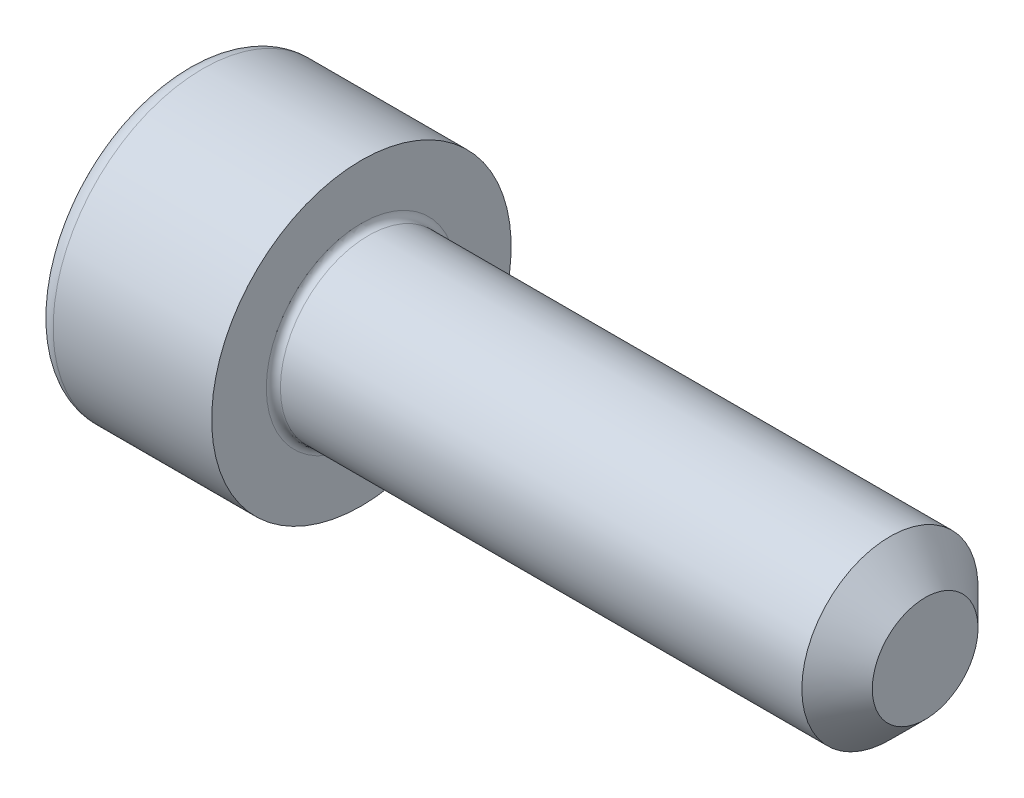
ISO-10303-21;
HEADER;
FILE_DESCRIPTION(('STEP AP214'),'2;1');
FILE_NAME('part.step','',(''),(''),'','','');
FILE_SCHEMA(('AUTOMOTIVE_DESIGN { 1 0 10303 214 1 1 1 1 }'));
ENDSEC;
DATA;
#1=APPLICATION_CONTEXT('core data for automotive mechanical design processes');
#2=APPLICATION_PROTOCOL_DEFINITION('international standard','automotive_design',2000,#1);
#3=PRODUCT_CONTEXT('',#1,'mechanical');
#4=PRODUCT('Part','Part','',(#3));
#5=PRODUCT_RELATED_PRODUCT_CATEGORY('part','',(#4));
#6=PRODUCT_DEFINITION_FORMATION('','',#4);
#7=PRODUCT_DEFINITION_CONTEXT('part definition',#1,'design');
#8=PRODUCT_DEFINITION('design','',#6,#7);
#9=PRODUCT_DEFINITION_SHAPE('','',#8);
#10=(LENGTH_UNIT() NAMED_UNIT(*) SI_UNIT(.MILLI.,.METRE.));
#11=(NAMED_UNIT(*) PLANE_ANGLE_UNIT() SI_UNIT($,.RADIAN.));
#12=(NAMED_UNIT(*) SI_UNIT($,.STERADIAN.) SOLID_ANGLE_UNIT());
#13=UNCERTAINTY_MEASURE_WITH_UNIT(LENGTH_MEASURE(1.E-05),#10,'distance_accuracy_value','');
#14=(GEOMETRIC_REPRESENTATION_CONTEXT(3) GLOBAL_UNCERTAINTY_ASSIGNED_CONTEXT((#13)) GLOBAL_UNIT_ASSIGNED_CONTEXT((#10,
#11,#12)) REPRESENTATION_CONTEXT('',''));
#15=CARTESIAN_POINT('',(0.,0.,0.));
#16=DIRECTION('',(0.,0.,1.));
#17=DIRECTION('',(1.,0.,0.));
#18=AXIS2_PLACEMENT_3D('',#15,#16,#17);
#19=CARTESIAN_POINT('',(-5.,0.,0.));
#20=DIRECTION('',(-1.,0.,0.));
#21=DIRECTION('',(0.,1.,0.));
#22=AXIS2_PLACEMENT_3D('',#19,#20,#21);
#23=PLANE('',#22);
#24=CARTESIAN_POINT('',(-5.,0.,0.));
#25=DIRECTION('',(1.,0.,0.));
#26=DIRECTION('',(0.,1.,0.));
#27=AXIS2_PLACEMENT_3D('',#24,#25,#26);
#28=CIRCLE('',#27,3.75);
#29=CARTESIAN_POINT('',(-5.,3.75,0.));
#30=VERTEX_POINT('',#29);
#31=EDGE_CURVE('E10',#30,#30,#28,.T.);
#32=ORIENTED_EDGE('',*,*,#31,.F.);
#33=EDGE_LOOP('',(#32));
#34=FACE_BOUND('',#33,.T.);
#35=DIRECTION('',(0.,0.500000000000001,-0.866025403784438));
#36=VECTOR('',#35,1.);
#37=CARTESIAN_POINT('',(-5.,1.15470053837925,2.));
#38=LINE('',#37,#36);
#39=CARTESIAN_POINT('',(-5.,1.15470053837925,2.));
#40=VERTEX_POINT('',#39);
#41=CARTESIAN_POINT('',(-5.,2.30940107675851,0.));
#42=VERTEX_POINT('',#41);
#43=EDGE_CURVE('E23',#40,#42,#38,.T.);
#44=ORIENTED_EDGE('',*,*,#43,.F.);
#45=DIRECTION('',(0.,1.,0.));
#46=VECTOR('',#45,1.);
#47=CARTESIAN_POINT('',(-5.,-1.15470053837925,2.));
#48=LINE('',#47,#46);
#49=CARTESIAN_POINT('',(-5.,-1.15470053837925,2.));
#50=VERTEX_POINT('',#49);
#51=EDGE_CURVE('E183',#50,#40,#48,.T.);
#52=ORIENTED_EDGE('',*,*,#51,.F.);
#53=DIRECTION('',(0.,0.5,0.866025403784439));
#54=VECTOR('',#53,1.);
#55=CARTESIAN_POINT('',(-5.,-2.30940107675851,0.));
#56=LINE('',#55,#54);
#57=CARTESIAN_POINT('',(-5.,-2.30940107675851,0.));
#58=VERTEX_POINT('',#57);
#59=EDGE_CURVE('E225',#58,#50,#56,.T.);
#60=ORIENTED_EDGE('',*,*,#59,.F.);
#61=DIRECTION('',(0.,-0.5,0.866025403784439));
#62=VECTOR('',#61,1.);
#63=CARTESIAN_POINT('',(-5.,-1.15470053837925,-2.));
#64=LINE('',#63,#62);
#65=CARTESIAN_POINT('',(-5.,-1.15470053837925,-2.));
#66=VERTEX_POINT('',#65);
#67=EDGE_CURVE('E132',#66,#58,#64,.T.);
#68=ORIENTED_EDGE('',*,*,#67,.F.);
#69=DIRECTION('',(0.,-1.,0.));
#70=VECTOR('',#69,1.);
#71=CARTESIAN_POINT('',(-5.,1.15470053837925,-2.));
#72=LINE('',#71,#70);
#73=CARTESIAN_POINT('',(-5.,1.15470053837925,-2.));
#74=VERTEX_POINT('',#73);
#75=EDGE_CURVE('E116',#74,#66,#72,.T.);
#76=ORIENTED_EDGE('',*,*,#75,.F.);
#77=DIRECTION('',(0.,-0.5,-0.866025403784439));
#78=VECTOR('',#77,1.);
#79=CARTESIAN_POINT('',(-5.,2.30940107675851,0.));
#80=LINE('',#79,#78);
#81=EDGE_CURVE('E110',#42,#74,#80,.T.);
#82=ORIENTED_EDGE('',*,*,#81,.F.);
#83=EDGE_LOOP('',(#44,#52,#60,#68,#76,#82));
#84=FACE_BOUND('',#83,.T.);
#85=ADVANCED_FACE('F16',(#34,#84),#23,.T.);
#86=CARTESIAN_POINT('',(-2.5,0.,0.));
#87=DIRECTION('',(-1.,0.,0.));
#88=DIRECTION('',(0.,0.,1.));
#89=AXIS2_PLACEMENT_3D('',#86,#87,#88);
#90=CONICAL_SURFACE('',#89,2.3094010767585,1.0471975511966);
#91=CARTESIAN_POINT('',(-1.16666666666667,0.,0.));
#92=VERTEX_POINT('',#91);
#93=VERTEX_LOOP('',#92);
#94=FACE_BOUND('',#93,.T.);
#95=CARTESIAN_POINT('',(-2.32136720504583,0.,1.99999999999985));
#96=CARTESIAN_POINT('',(-2.32131550241813,0.0797196102101617,2.00000000000306));
#97=CARTESIAN_POINT('',(-2.32411866043126,0.159413689200123,2.00000000000183));
#98=CARTESIAN_POINT('',(-2.33502998791878,0.318342403087673,1.99999999999818));
#99=CARTESIAN_POINT('',(-2.3431315531358,0.397577486228106,1.99999999999578));
#100=CARTESIAN_POINT('',(-2.36424196790677,0.555418039197688,1.99999999999748));
#101=CARTESIAN_POINT('',(-2.37725319872079,0.634023184574532,2.0000000000016));
#102=CARTESIAN_POINT('',(-2.40754514450711,0.790421298244566,1.99999999999841));
#103=CARTESIAN_POINT('',(-2.42482740199922,0.868213962499915,1.9999999999911));
#104=CARTESIAN_POINT('',(-2.46120934199551,1.01564572423579,1.99999999999472));
#105=CARTESIAN_POINT('',(-2.47998586173831,1.08536436762664,2.00000000000401));
#106=CARTESIAN_POINT('',(-2.5,1.15470053832392,2.00000000003195));
#107=B_SPLINE_CURVE_WITH_KNOTS('',3,(#95,#96,#97,#98,#99,#100,#101,#102,#103,#104,#105,#106),
.UNSPECIFIED.,.F.,.F.,(4,2,2,2,2,4),(0.,0.239068538986219,0.477839654877296,0.716726727438717,
0.955700202629129,1.17222815680731),.UNSPECIFIED.);
#108=CARTESIAN_POINT('',(-2.32136720504592,0.,2.));
#109=VERTEX_POINT('',#108);
#110=CARTESIAN_POINT('',(-2.49999999997221,1.15470053837925,2.));
#111=VERTEX_POINT('',#110);
#112=EDGE_CURVE('E178',#109,#111,#107,.T.);
#113=ORIENTED_EDGE('',*,*,#112,.T.);
#114=CARTESIAN_POINT('',(-2.49999999998611,1.15470053843378,1.99999999996852));
#115=CARTESIAN_POINT('',(-2.46228362849492,1.21997972300278,1.88693313528492));
#116=CARTESIAN_POINT('',(-2.42898652027917,1.28598045813641,1.77261650884483));
#117=CARTESIAN_POINT('',(-2.38655404777783,1.38958352282162,1.59317073714211));
#118=CARTESIAN_POINT('',(-2.37325675430922,1.42677343092606,1.52875592681503));
#119=CARTESIAN_POINT('',(-2.35093110027913,1.50147465395394,1.39936961300656));
#120=CARTESIAN_POINT('',(-2.34190226311298,1.53898593251758,1.33439817250222));
#121=CARTESIAN_POINT('',(-2.32591051793947,1.62921268695325,1.17812084989304));
#122=CARTESIAN_POINT('',(-2.32120225532939,1.68203400845146,1.08663163806296));
#123=CARTESIAN_POINT('',(-2.3215412281579,1.78767402974622,0.903657752348425));
#124=CARTESIAN_POINT('',(-2.32659003039377,1.84049272775946,0.812173081552283));
#125=CARTESIAN_POINT('',(-2.3460152406712,1.94632453428992,0.628867016694233));
#126=CARTESIAN_POINT('',(-2.36050249725211,1.99933241122694,0.537054684062406));
#127=CARTESIAN_POINT('',(-2.39754913624201,2.10464742363962,0.354643728709719));
#128=CARTESIAN_POINT('',(-2.42011316511624,2.15695413773811,0.264045835829832));
#129=CARTESIAN_POINT('',(-2.46265071941254,2.2425451198808,0.115797904891742));
#130=CARTESIAN_POINT('',(-2.48075490199722,2.27606376499449,0.0577419105088828));
#131=CARTESIAN_POINT('',(-2.49999999998611,2.3094010767585,5.73148604723116E-11));
#132=B_SPLINE_CURVE_WITH_KNOTS('',3,(#114,#115,#116,#117,#118,#119,#120,#121,#122,#123,#124,
#125,#126,#127,#128,#129,#130,#131),.UNSPECIFIED.,.F.,.F.,(4,2,2,2,2,2,2,2,4),(0.,
0.407777568841093,0.634364418722332,0.860925962529872,1.17771289725812,1.49455070611276,
1.81517832748425,2.13599069911638,2.34422944405424),.UNSPECIFIED.);
#133=CARTESIAN_POINT('',(-2.49999999997221,2.30940107675851,0.));
#134=VERTEX_POINT('',#133);
#135=EDGE_CURVE('E164',#111,#134,#132,.T.);
#136=ORIENTED_EDGE('',*,*,#135,.T.);
#137=CARTESIAN_POINT('',(-2.49999999998611,2.3094010767585,-6.38932573467605E-11));
#138=CARTESIAN_POINT('',(-2.4622836284956,2.24412189190189,-0.113066864578103));
#139=CARTESIAN_POINT('',(-2.42898652028046,2.17812115689804,-0.227383491089732));
#140=CARTESIAN_POINT('',(-2.38655404777963,2.07451809234659,-0.406829262864516));
#141=CARTESIAN_POINT('',(-2.37325675431111,2.03732818427636,-0.471244073209609));
#142=CARTESIAN_POINT('',(-2.35093110028098,1.96262696113167,-0.600630386947137));
#143=CARTESIAN_POINT('',(-2.34190226311472,1.92511568241702,-0.665601827362531));
#144=CARTESIAN_POINT('',(-2.32591051794074,1.83488892822205,-0.821879150105676));
#145=CARTESIAN_POINT('',(-2.32120225533013,1.7820676073555,-0.91336836229718));
#146=CARTESIAN_POINT('',(-2.32154122815707,1.67642758474773,-1.09634224724721));
#147=CARTESIAN_POINT('',(-2.3265900303919,1.62360888478942,-1.18782691691719));
#148=CARTESIAN_POINT('',(-2.3460152406666,1.51777707922394,-1.37113298232285));
#149=CARTESIAN_POINT('',(-2.36050249724555,1.46476920525531,-1.46294531666216));
#150=CARTESIAN_POINT('',(-2.39754913623093,1.359454190203,-1.64535627047848));
#151=CARTESIAN_POINT('',(-2.42011316510261,1.30714747049154,-1.73595416011166));
#152=CARTESIAN_POINT('',(-2.46265071940074,1.2215564873035,-1.88420209046589));
#153=CARTESIAN_POINT('',(-2.48075490199095,1.18803784387184,-1.94225808584523));
#154=CARTESIAN_POINT('',(-2.4999999999861,1.15470053842888,-1.99999999997135));
#155=B_SPLINE_CURVE_WITH_KNOTS('',3,(#137,#138,#139,#140,#141,#142,#143,#144,#145,#146,#147,
#148,#149,#150,#151,#152,#153,#154),.UNSPECIFIED.,.F.,.F.,(4,2,2,2,2,2,2,2,4),(0.,
0.407777568832167,0.634364418708909,0.860925962511965,1.17771289723187,1.49455070607814,
1.81517832743263,2.13599069904778,2.3442294440535),.UNSPECIFIED.);
#156=CARTESIAN_POINT('',(-2.49999999997221,1.15470053837925,-2.));
#157=VERTEX_POINT('',#156);
#158=EDGE_CURVE('E150',#134,#157,#155,.T.);
#159=ORIENTED_EDGE('',*,*,#158,.T.);
#160=CARTESIAN_POINT('',(-2.4999999999861,1.15470053832392,-2.00000000003195));
#161=CARTESIAN_POINT('',(-2.46228362849563,1.02414216890014,-1.99999999986489));
#162=CARTESIAN_POINT('',(-2.4289865202805,0.892140698764289,-1.99999999993892));
#163=CARTESIAN_POINT('',(-2.38655404777969,0.684934569530033,-2.00000000001483));
#164=CARTESIAN_POINT('',(-2.37325675431117,0.610554753356163,-2.00000000003416));
#165=CARTESIAN_POINT('',(-2.35093110028104,0.461152307185191,-1.99999999996585));
#166=CARTESIAN_POINT('',(-2.34190226311477,0.386129749907719,-1.99999999987822));
#167=CARTESIAN_POINT('',(-2.32591051794077,0.205676241279372,-2.00000000001593));
#168=CARTESIAN_POINT('',(-2.32120225533015,0.100033598916102,-2.00000000037981));
#169=CARTESIAN_POINT('',(-2.32154122815705,-0.111246444983501,-1.99999999962013));
#170=CARTESIAN_POINT('',(-2.32659003039185,-0.216883842953614,-1.99999999849635));
#171=CARTESIAN_POINT('',(-2.34601524066647,-0.428547455045295,-1.9999999990511));
#172=CARTESIAN_POINT('',(-2.36050249724539,-0.534563205948143,-2.00000000076332));
#173=CARTESIAN_POINT('',(-2.39754913623069,-0.74519323340766,-1.99999999923624));
#174=CARTESIAN_POINT('',(-2.42011316510232,-0.849806667214919,-1.99999999599407));
#175=CARTESIAN_POINT('',(-2.4626507194005,-1.02098863255456,-1.99999999539546));
#176=CARTESIAN_POINT('',(-2.48075490199082,-1.08802592111134,-1.99999999637292));
#177=CARTESIAN_POINT('',(-2.4999999999861,-1.15470053832962,-2.00000000002866));
#178=B_SPLINE_CURVE_WITH_KNOTS('',3,(#160,#161,#162,#163,#164,#165,#166,#167,#168,#169,#170,
#171,#172,#173,#174,#175,#176,#177),.UNSPECIFIED.,.F.,.F.,(4,2,2,2,2,2,2,2,4),(0.,
0.407777568831901,0.634364418708497,0.860925962511407,1.1777128972311,1.49455070607716,
1.81517832743144,2.13599069904639,2.3442294440535),.UNSPECIFIED.);
#179=CARTESIAN_POINT('',(-2.49999999997221,-1.15470053837925,-2.));
#180=VERTEX_POINT('',#179);
#181=EDGE_CURVE('E125',#157,#180,#178,.T.);
#182=ORIENTED_EDGE('',*,*,#181,.T.);
#183=CARTESIAN_POINT('',(-2.4999999999861,-1.15470053843459,-1.99999999996805));
#184=CARTESIAN_POINT('',(-2.46228362849561,-1.21997972300183,-1.88693313528679));
#185=CARTESIAN_POINT('',(-2.42898652028047,-1.28598045813391,-1.77261650884921));
#186=CARTESIAN_POINT('',(-2.38655404777964,-1.38958352281684,-1.59317073715036));
#187=CARTESIAN_POINT('',(-2.37325675431112,-1.42677343092053,-1.5287559268246));
#188=CARTESIAN_POINT('',(-2.35093110028099,-1.50147465394689,-1.39936961301878));
#189=CARTESIAN_POINT('',(-2.34190226311473,-1.53898593250976,-1.33439817251576));
#190=CARTESIAN_POINT('',(-2.32591051794074,-1.62921268694325,-1.17812084991035));
#191=CARTESIAN_POINT('',(-2.32120225533014,-1.68203400844004,-1.08663163808273));
#192=CARTESIAN_POINT('',(-2.32154122815707,-1.787674029732,-0.903657752373051));
#193=CARTESIAN_POINT('',(-2.32659003039189,-1.84049272774386,-0.812173081579306));
#194=CARTESIAN_POINT('',(-2.34601524066657,-1.94632453427018,-0.62886701672843));
#195=CARTESIAN_POINT('',(-2.36050249724552,-1.99933241120445,-0.537054684101358));
#196=CARTESIAN_POINT('',(-2.39754913623088,-2.10464742361175,-0.354643728757994));
#197=CARTESIAN_POINT('',(-2.42011316510254,-2.1569541377076,-0.264045835882673));
#198=CARTESIAN_POINT('',(-2.46265071940069,-2.24254511985885,-0.115797904929758));
#199=CARTESIAN_POINT('',(-2.48075490199092,-2.27606376498357,-0.0577419105277827));
#200=CARTESIAN_POINT('',(-2.49999999998611,-2.3094010767585,-5.7309482651391E-11));
#201=B_SPLINE_CURVE_WITH_KNOTS('',3,(#183,#184,#185,#186,#187,#188,#189,#190,#191,#192,#193,
#194,#195,#196,#197,#198,#199,#200),.UNSPECIFIED.,.F.,.F.,(4,2,2,2,2,2,2,2,4),(0.,
0.407777568832121,0.634364418708837,0.860925962511868,1.17771289723173,1.49455070607796,
1.81517832743237,2.13599069904745,2.3442294440535),.UNSPECIFIED.);
#202=CARTESIAN_POINT('',(-2.49999999997221,-2.30940107675851,0.));
#203=VERTEX_POINT('',#202);
#204=EDGE_CURVE('E157',#180,#203,#201,.T.);
#205=ORIENTED_EDGE('',*,*,#204,.T.);
#206=CARTESIAN_POINT('',(-2.49999999998611,-2.3094010767585,6.38977724912849E-11));
#207=CARTESIAN_POINT('',(-2.46228362849561,-2.24412189190191,0.113066864578085));
#208=CARTESIAN_POINT('',(-2.42898652028047,-2.17812115689806,0.227383491089691));
#209=CARTESIAN_POINT('',(-2.38655404777965,-2.07451809234663,0.406829262864438));
#210=CARTESIAN_POINT('',(-2.37325675431113,-2.03732818427642,0.471244073209517));
#211=CARTESIAN_POINT('',(-2.350931100281,-1.96262696113174,0.600630386947018));
#212=CARTESIAN_POINT('',(-2.34190226311473,-1.9251156824171,0.665601827362399));
#213=CARTESIAN_POINT('',(-2.32591051794075,-1.83488892822215,0.821879150105511));
#214=CARTESIAN_POINT('',(-2.32120225533014,-1.78206760735561,0.913368362296995));
#215=CARTESIAN_POINT('',(-2.32154122815707,-1.67642758474786,1.09634224724699));
#216=CARTESIAN_POINT('',(-2.32659003039189,-1.62360888478956,1.18782691691694));
#217=CARTESIAN_POINT('',(-2.34601524066656,-1.51777707922411,1.37113298232257));
#218=CARTESIAN_POINT('',(-2.3605024972455,-1.46476920525549,1.46294531666186));
#219=CARTESIAN_POINT('',(-2.39754913623086,-1.35945419020319,1.64535627047814));
#220=CARTESIAN_POINT('',(-2.42011316510251,-1.30714747049175,1.7359541601113));
#221=CARTESIAN_POINT('',(-2.46265071940067,-1.22155648730365,1.88420209046564));
#222=CARTESIAN_POINT('',(-2.48075490199091,-1.18803784387191,1.9422580858451));
#223=CARTESIAN_POINT('',(-2.49999999998611,-1.15470053842889,1.99999999997134));
#224=B_SPLINE_CURVE_WITH_KNOTS('',3,(#206,#207,#208,#209,#210,#211,#212,#213,#214,#215,#216,
#217,#218,#219,#220,#221,#222,#223),.UNSPECIFIED.,.F.,.F.,(4,2,2,2,2,2,2,2,4),(0.,
0.407777568832085,0.634364418708781,0.860925962511791,1.17771289723162,1.49455070607783,
1.81517832743225,2.13599069904732,2.34422944405349),.UNSPECIFIED.);
#225=CARTESIAN_POINT('',(-2.49999999997221,-1.15470053837925,2.));
#226=VERTEX_POINT('',#225);
#227=EDGE_CURVE('E171',#203,#226,#224,.T.);
#228=ORIENTED_EDGE('',*,*,#227,.T.);
#229=CARTESIAN_POINT('',(-2.49999999998611,-1.15470053832392,2.00000000003195));
#230=CARTESIAN_POINT('',(-2.47488586884173,-1.06770564660957,2.00000000002455));
#231=CARTESIAN_POINT('',(-2.45171842086109,-0.980086332860074,2.00000000000963));
#232=CARTESIAN_POINT('',(-2.4102156404833,-0.803579815537697,1.99999999999036));
#233=CARTESIAN_POINT('',(-2.39188764625717,-0.71469089951397,1.99999999998601));
#234=CARTESIAN_POINT('',(-2.3631145018882,-0.547674670195806,2.00000000001183));
#235=CARTESIAN_POINT('',(-2.35194868794953,-0.469673441102498,2.00000000003752));
#236=CARTESIAN_POINT('',(-2.33459755429522,-0.313163070549436,1.99999999996251));
#237=CARTESIAN_POINT('',(-2.32840835880135,-0.234654372436433,1.99999999986191));
#238=CARTESIAN_POINT('',(-2.32370864271904,-0.130051790428277,1.9999999999398));
#239=CARTESIAN_POINT('',(-2.32283138027988,-0.104051512701441,1.99999999997654));
#240=CARTESIAN_POINT('',(-2.32166060243322,-0.0520347058284984,2.00000000002347));
#241=CARTESIAN_POINT('',(-2.32136715710422,-0.0260181751063475,2.00000000003364));
#242=CARTESIAN_POINT('',(-2.32136720504583,0.,1.99999999999985));
#243=B_SPLINE_CURVE_WITH_KNOTS('',3,(#229,#230,#231,#232,#233,#234,#235,#236,#237,#238,#239,
#240,#241,#242),.UNSPECIFIED.,.F.,.F.,(4,2,2,2,2,2,4),(0.,0.271712623420874,0.543834915006432,
0.780083913555509,1.01614874327482,1.09418899413783,1.17223861199891),.UNSPECIFIED.);
#244=EDGE_CURVE('E182',#226,#109,#243,.T.);
#245=ORIENTED_EDGE('',*,*,#244,.T.);
#246=EDGE_LOOP('',(#113,#136,#159,#182,#205,#228,#245));
#247=FACE_BOUND('',#246,.T.);
#248=ADVANCED_FACE('F138',(#94,#247),#90,.F.);
#249=CARTESIAN_POINT('',(0.195534180126147,-1.15470053837925,2.));
#250=DIRECTION('',(0.,0.,1.));
#251=DIRECTION('',(0.,1.,0.));
#252=AXIS2_PLACEMENT_3D('',#249,#250,#251);
#253=PLANE('',#252);
#254=ORIENTED_EDGE('',*,*,#244,.F.);
#255=DIRECTION('',(-1.,0.,0.));
#256=VECTOR('',#255,1.);
#257=CARTESIAN_POINT('',(-2.49999999997221,-1.15470053837925,2.));
#258=LINE('',#257,#256);
#259=EDGE_CURVE('E221',#226,#50,#258,.T.);
#260=ORIENTED_EDGE('',*,*,#259,.T.);
#261=ORIENTED_EDGE('',*,*,#51,.T.);
#262=DIRECTION('',(-1.,0.,0.));
#263=VECTOR('',#262,1.);
#264=CARTESIAN_POINT('',(-2.49999999997221,1.15470053837925,2.));
#265=LINE('',#264,#263);
#266=EDGE_CURVE('E119',#111,#40,#265,.T.);
#267=ORIENTED_EDGE('',*,*,#266,.F.);
#268=ORIENTED_EDGE('',*,*,#112,.F.);
#269=EDGE_LOOP('',(#254,#260,#261,#267,#268));
#270=FACE_BOUND('',#269,.T.);
#271=ADVANCED_FACE('F142',(#270),#253,.F.);
#272=CARTESIAN_POINT('',(0.195534180126147,-2.30940107675851,0.));
#273=DIRECTION('',(0.,-0.866025403784438,0.5));
#274=DIRECTION('',(0.,0.5,0.866025403784438));
#275=AXIS2_PLACEMENT_3D('',#272,#273,#274);
#276=PLANE('',#275);
#277=ORIENTED_EDGE('',*,*,#227,.F.);
#278=DIRECTION('',(-1.,0.,0.));
#279=VECTOR('',#278,1.);
#280=CARTESIAN_POINT('',(-2.49999999997221,-2.30940107675851,0.));
#281=LINE('',#280,#279);
#282=EDGE_CURVE('E228',#203,#58,#281,.T.);
#283=ORIENTED_EDGE('',*,*,#282,.T.);
#284=ORIENTED_EDGE('',*,*,#59,.T.);
#285=ORIENTED_EDGE('',*,*,#259,.F.);
#286=EDGE_LOOP('',(#277,#283,#284,#285));
#287=FACE_BOUND('',#286,.T.);
#288=ADVANCED_FACE('F189',(#287),#276,.F.);
#289=CARTESIAN_POINT('',(0.195534180126147,-1.15470053837925,-2.));
#290=DIRECTION('',(0.,-0.866025403784439,-0.5));
#291=DIRECTION('',(0.,-0.5,0.866025403784439));
#292=AXIS2_PLACEMENT_3D('',#289,#290,#291);
#293=PLANE('',#292);
#294=ORIENTED_EDGE('',*,*,#204,.F.);
#295=DIRECTION('',(-1.,0.,0.));
#296=VECTOR('',#295,1.);
#297=CARTESIAN_POINT('',(-2.49999999997221,-1.15470053837925,-2.));
#298=LINE('',#297,#296);
#299=EDGE_CURVE('E122',#180,#66,#298,.T.);
#300=ORIENTED_EDGE('',*,*,#299,.T.);
#301=ORIENTED_EDGE('',*,*,#67,.T.);
#302=ORIENTED_EDGE('',*,*,#282,.F.);
#303=EDGE_LOOP('',(#294,#300,#301,#302));
#304=FACE_BOUND('',#303,.T.);
#305=ADVANCED_FACE('F200',(#304),#293,.F.);
#306=CARTESIAN_POINT('',(0.195534180126147,1.15470053837925,-2.));
#307=DIRECTION('',(0.,0.,-1.));
#308=DIRECTION('',(0.,-1.,0.));
#309=AXIS2_PLACEMENT_3D('',#306,#307,#308);
#310=PLANE('',#309);
#311=ORIENTED_EDGE('',*,*,#181,.F.);
#312=DIRECTION('',(-1.,0.,0.));
#313=VECTOR('',#312,1.);
#314=CARTESIAN_POINT('',(-2.49999999997221,1.15470053837925,-2.));
#315=LINE('',#314,#313);
#316=EDGE_CURVE('E113',#157,#74,#315,.T.);
#317=ORIENTED_EDGE('',*,*,#316,.T.);
#318=ORIENTED_EDGE('',*,*,#75,.T.);
#319=ORIENTED_EDGE('',*,*,#299,.F.);
#320=EDGE_LOOP('',(#311,#317,#318,#319));
#321=FACE_BOUND('',#320,.T.);
#322=ADVANCED_FACE('F134',(#321),#310,.F.);
#323=CARTESIAN_POINT('',(0.195534180126147,2.30940107675851,0.));
#324=DIRECTION('',(0.,0.866025403784439,-0.5));
#325=DIRECTION('',(0.,-0.5,-0.866025403784439));
#326=AXIS2_PLACEMENT_3D('',#323,#324,#325);
#327=PLANE('',#326);
#328=ORIENTED_EDGE('',*,*,#158,.F.);
#329=DIRECTION('',(-1.,0.,0.));
#330=VECTOR('',#329,1.);
#331=CARTESIAN_POINT('',(-2.49999999997221,2.30940107675851,0.));
#332=LINE('',#331,#330);
#333=EDGE_CURVE('E107',#134,#42,#332,.T.);
#334=ORIENTED_EDGE('',*,*,#333,.T.);
#335=ORIENTED_EDGE('',*,*,#81,.T.);
#336=ORIENTED_EDGE('',*,*,#316,.F.);
#337=EDGE_LOOP('',(#328,#334,#335,#336));
#338=FACE_BOUND('',#337,.T.);
#339=ADVANCED_FACE('F196',(#338),#327,.F.);
#340=CARTESIAN_POINT('',(0.195534180126147,1.15470053837925,2.));
#341=DIRECTION('',(0.,0.866025403784438,0.500000000000001));
#342=DIRECTION('',(0.,0.500000000000001,-0.866025403784438));
#343=AXIS2_PLACEMENT_3D('',#340,#341,#342);
#344=PLANE('',#343);
#345=ORIENTED_EDGE('',*,*,#135,.F.);
#346=ORIENTED_EDGE('',*,*,#266,.T.);
#347=ORIENTED_EDGE('',*,*,#43,.T.);
#348=ORIENTED_EDGE('',*,*,#333,.F.);
#349=EDGE_LOOP('',(#345,#346,#347,#348));
#350=FACE_BOUND('',#349,.T.);
#351=ADVANCED_FACE('F191',(#350),#344,.F.);
#352=CARTESIAN_POINT('',(-5.,0.,0.));
#353=DIRECTION('',(1.,0.,0.));
#354=DIRECTION('',(0.,1.,0.));
#355=AXIS2_PLACEMENT_3D('',#352,#353,#354);
#356=CYLINDRICAL_SURFACE('',#355,4.25);
#357=CARTESIAN_POINT('',(0.,0.,0.));
#358=DIRECTION('',(1.,0.,0.));
#359=DIRECTION('',(0.,1.,0.));
#360=AXIS2_PLACEMENT_3D('',#357,#358,#359);
#361=CIRCLE('',#360,4.25);
#362=CARTESIAN_POINT('',(0.,4.25,0.));
#363=VERTEX_POINT('',#362);
#364=EDGE_CURVE('E104',#363,#363,#361,.T.);
#365=ORIENTED_EDGE('',*,*,#364,.F.);
#366=EDGE_LOOP('',(#365));
#367=FACE_BOUND('',#366,.T.);
#368=CARTESIAN_POINT('',(-4.5,0.,0.));
#369=DIRECTION('',(1.,0.,0.));
#370=DIRECTION('',(0.,1.,0.));
#371=AXIS2_PLACEMENT_3D('',#368,#369,#370);
#372=CIRCLE('',#371,4.25);
#373=CARTESIAN_POINT('',(-4.5,4.25,0.));
#374=VERTEX_POINT('',#373);
#375=EDGE_CURVE('E102',#374,#374,#372,.T.);
#376=ORIENTED_EDGE('',*,*,#375,.T.);
#377=EDGE_LOOP('',(#376));
#378=FACE_BOUND('',#377,.T.);
#379=ADVANCED_FACE('F195',(#367,#378),#356,.T.);
#380=CARTESIAN_POINT('',(0.,0.,0.));
#381=DIRECTION('',(1.,0.,0.));
#382=DIRECTION('',(0.,1.,0.));
#383=AXIS2_PLACEMENT_3D('',#380,#381,#382);
#384=PLANE('',#383);
#385=ORIENTED_EDGE('',*,*,#364,.T.);
#386=EDGE_LOOP('',(#385));
#387=FACE_BOUND('',#386,.T.);
#388=CARTESIAN_POINT('',(0.,0.,0.));
#389=DIRECTION('',(1.,0.,0.));
#390=DIRECTION('',(0.,0.,1.));
#391=AXIS2_PLACEMENT_3D('',#388,#389,#390);
#392=CIRCLE('',#391,2.7);
#393=CARTESIAN_POINT('',(0.,0.,2.7));
#394=VERTEX_POINT('',#393);
#395=EDGE_CURVE('E94',#394,#394,#392,.T.);
#396=ORIENTED_EDGE('',*,*,#395,.F.);
#397=EDGE_LOOP('',(#396));
#398=FACE_BOUND('',#397,.T.);
#399=ADVANCED_FACE('F243',(#387,#398),#384,.T.);
#400=CARTESIAN_POINT('',(0.,0.,0.));
#401=DIRECTION('',(1.,0.,0.));
#402=DIRECTION('',(0.,0.,1.));
#403=AXIS2_PLACEMENT_3D('',#400,#401,#402);
#404=CYLINDRICAL_SURFACE('',#403,2.5);
#405=CARTESIAN_POINT('',(15.,0.,0.));
#406=DIRECTION('',(1.,0.,0.));
#407=DIRECTION('',(0.,0.,1.));
#408=AXIS2_PLACEMENT_3D('',#405,#406,#407);
#409=CIRCLE('',#408,2.5);
#410=CARTESIAN_POINT('',(15.,0.,2.5));
#411=VERTEX_POINT('',#410);
#412=EDGE_CURVE('E99',#411,#411,#409,.T.);
#413=ORIENTED_EDGE('',*,*,#412,.F.);
#414=EDGE_LOOP('',(#413));
#415=FACE_BOUND('',#414,.T.);
#416=CARTESIAN_POINT('',(0.2,0.,0.));
#417=DIRECTION('',(1.,0.,0.));
#418=DIRECTION('',(0.,0.,1.));
#419=AXIS2_PLACEMENT_3D('',#416,#417,#418);
#420=CIRCLE('',#419,2.5);
#421=CARTESIAN_POINT('',(0.2,0.,2.5));
#422=VERTEX_POINT('',#421);
#423=EDGE_CURVE('E88',#422,#422,#420,.T.);
#424=ORIENTED_EDGE('',*,*,#423,.T.);
#425=EDGE_LOOP('',(#424));
#426=FACE_BOUND('',#425,.T.);
#427=ADVANCED_FACE('F89',(#415,#426),#404,.T.);
#428=CARTESIAN_POINT('',(15.,0.,0.));
#429=DIRECTION('',(-1.,0.,0.));
#430=DIRECTION('',(0.,0.,1.));
#431=AXIS2_PLACEMENT_3D('',#428,#429,#430);
#432=CONICAL_SURFACE('',#431,2.5,0.785398163397448);
#433=CARTESIAN_POINT('',(16.,0.,0.));
#434=DIRECTION('',(1.,0.,0.));
#435=DIRECTION('',(0.,0.,1.));
#436=AXIS2_PLACEMENT_3D('',#433,#434,#435);
#437=CIRCLE('',#436,1.5);
#438=CARTESIAN_POINT('',(16.,0.,1.5));
#439=VERTEX_POINT('',#438);
#440=EDGE_CURVE('E91',#439,#439,#437,.T.);
#441=ORIENTED_EDGE('',*,*,#440,.F.);
#442=EDGE_LOOP('',(#441));
#443=FACE_BOUND('',#442,.T.);
#444=ORIENTED_EDGE('',*,*,#412,.T.);
#445=EDGE_LOOP('',(#444));
#446=FACE_BOUND('',#445,.T.);
#447=ADVANCED_FACE('F250',(#443,#446),#432,.T.);
#448=CARTESIAN_POINT('',(16.,0.,0.));
#449=DIRECTION('',(1.,0.,0.));
#450=DIRECTION('',(0.,0.,1.));
#451=AXIS2_PLACEMENT_3D('',#448,#449,#450);
#452=PLANE('',#451);
#453=ORIENTED_EDGE('',*,*,#440,.T.);
#454=EDGE_LOOP('',(#453));
#455=FACE_BOUND('',#454,.T.);
#456=ADVANCED_FACE('F254',(#455),#452,.T.);
#457=CARTESIAN_POINT('',(-4.5,0.,0.));
#458=DIRECTION('',(1.,0.,0.));
#459=DIRECTION('',(0.,1.,0.));
#460=AXIS2_PLACEMENT_3D('',#457,#458,#459);
#461=TOROIDAL_SURFACE('',#460,3.75,0.5);
#462=ORIENTED_EDGE('',*,*,#375,.F.);
#463=EDGE_LOOP('',(#462));
#464=FACE_BOUND('',#463,.T.);
#465=ORIENTED_EDGE('',*,*,#31,.T.);
#466=EDGE_LOOP('',(#465));
#467=FACE_BOUND('',#466,.T.);
#468=ADVANCED_FACE('F143',(#464,#467),#461,.T.);
#469=CARTESIAN_POINT('',(0.2,0.,0.));
#470=DIRECTION('',(1.,0.,0.));
#471=DIRECTION('',(0.,0.,1.));
#472=AXIS2_PLACEMENT_3D('',#469,#470,#471);
#473=TOROIDAL_SURFACE('',#472,2.7,0.2);
#474=ORIENTED_EDGE('',*,*,#423,.F.);
#475=EDGE_LOOP('',(#474));
#476=FACE_BOUND('',#475,.T.);
#477=ORIENTED_EDGE('',*,*,#395,.T.);
#478=EDGE_LOOP('',(#477));
#479=FACE_BOUND('',#478,.T.);
#480=ADVANCED_FACE('F256',(#476,#479),#473,.F.);
#481=CLOSED_SHELL('',(#85,#248,#271,#288,#305,#322,#339,#351,#379,#399,#427,#447,#456,#468,#480));
#482=MANIFOLD_SOLID_BREP('B1',#481);
#483=ADVANCED_BREP_SHAPE_REPRESENTATION('',(#18,#482),#14);
#484=SHAPE_DEFINITION_REPRESENTATION(#9,#483);
ENDSEC;
END-ISO-10303-21;
